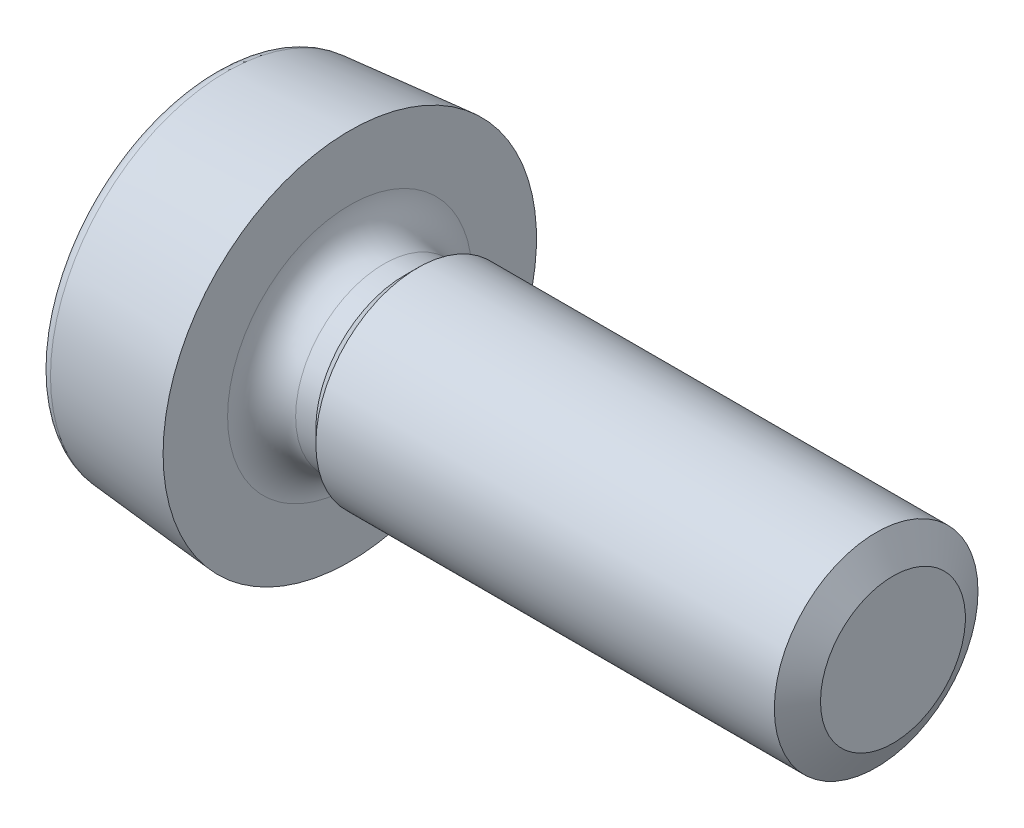
ISO-10303-21;
HEADER;
FILE_DESCRIPTION(('STEP AP214'),'2;1');
FILE_NAME('part.step','',(''),(''),'','','');
FILE_SCHEMA(('AUTOMOTIVE_DESIGN { 1 0 10303 214 1 1 1 1 }'));
ENDSEC;
DATA;
#1=APPLICATION_CONTEXT('core data for automotive mechanical design processes');
#2=APPLICATION_PROTOCOL_DEFINITION('international standard','automotive_design',2000,#1);
#3=PRODUCT_CONTEXT('',#1,'mechanical');
#4=PRODUCT('Part','Part','',(#3));
#5=PRODUCT_RELATED_PRODUCT_CATEGORY('part','',(#4));
#6=PRODUCT_DEFINITION_FORMATION('','',#4);
#7=PRODUCT_DEFINITION_CONTEXT('part definition',#1,'design');
#8=PRODUCT_DEFINITION('design','',#6,#7);
#9=PRODUCT_DEFINITION_SHAPE('','',#8);
#10=(LENGTH_UNIT() NAMED_UNIT(*) SI_UNIT(.MILLI.,.METRE.));
#11=(NAMED_UNIT(*) PLANE_ANGLE_UNIT() SI_UNIT($,.RADIAN.));
#12=(NAMED_UNIT(*) SI_UNIT($,.STERADIAN.) SOLID_ANGLE_UNIT());
#13=UNCERTAINTY_MEASURE_WITH_UNIT(LENGTH_MEASURE(1.E-05),#10,'distance_accuracy_value','');
#14=(GEOMETRIC_REPRESENTATION_CONTEXT(3) GLOBAL_UNCERTAINTY_ASSIGNED_CONTEXT((#13)) GLOBAL_UNIT_ASSIGNED_CONTEXT((#10,
#11,#12)) REPRESENTATION_CONTEXT('',''));
#15=CARTESIAN_POINT('',(0.,0.,0.));
#16=DIRECTION('',(0.,0.,1.));
#17=DIRECTION('',(1.,0.,0.));
#18=AXIS2_PLACEMENT_3D('',#15,#16,#17);
#19=CARTESIAN_POINT('',(0.,2.39175643814468,0.));
#20=DIRECTION('',(1.,0.,0.));
#21=DIRECTION('',(0.,0.,-1.));
#22=AXIS2_PLACEMENT_3D('',#19,#20,#21);
#23=PLANE('',#22);
#24=CARTESIAN_POINT('',(0.,0.,0.));
#25=DIRECTION('',(-1.,0.,0.));
#26=DIRECTION('',(0.,0.,1.));
#27=AXIS2_PLACEMENT_3D('',#24,#25,#26);
#28=CIRCLE('',#27,2.39175643814468);
#29=CARTESIAN_POINT('',(0.,0.,2.39175643814468));
#30=VERTEX_POINT('',#29);
#31=EDGE_CURVE('E171',#30,#30,#28,.T.);
#32=ORIENTED_EDGE('',*,*,#31,.T.);
#33=EDGE_LOOP('',(#32));
#34=FACE_BOUND('',#33,.T.);
#35=DIRECTION('',(0.,0.,1.));
#36=VECTOR('',#35,1.);
#37=CARTESIAN_POINT('',(0.,-0.250000000000006,1.75));
#38=LINE('',#37,#36);
#39=CARTESIAN_POINT('',(0.,-0.250000000000001,0.25));
#40=VERTEX_POINT('',#39);
#41=CARTESIAN_POINT('',(0.,-0.250000000000006,1.75));
#42=VERTEX_POINT('',#41);
#43=EDGE_CURVE('E137',#40,#42,#38,.T.);
#44=ORIENTED_EDGE('',*,*,#43,.F.);
#45=DIRECTION('',(0.,1.,0.));
#46=VECTOR('',#45,1.);
#47=CARTESIAN_POINT('',(0.,1.75,0.25));
#48=LINE('',#47,#46);
#49=CARTESIAN_POINT('',(0.,-1.75,0.25));
#50=VERTEX_POINT('',#49);
#51=EDGE_CURVE('E156',#50,#40,#48,.T.);
#52=ORIENTED_EDGE('',*,*,#51,.F.);
#53=DIRECTION('',(0.,0.,1.));
#54=VECTOR('',#53,1.);
#55=CARTESIAN_POINT('',(0.,-1.75,-0.25));
#56=LINE('',#55,#54);
#57=CARTESIAN_POINT('',(0.,-1.75,-0.25));
#58=VERTEX_POINT('',#57);
#59=EDGE_CURVE('E148',#58,#50,#56,.T.);
#60=ORIENTED_EDGE('',*,*,#59,.F.);
#61=DIRECTION('',(0.,-1.,0.));
#62=VECTOR('',#61,1.);
#63=CARTESIAN_POINT('',(0.,1.75,-0.25));
#64=LINE('',#63,#62);
#65=CARTESIAN_POINT('',(0.,-0.249999999999999,-0.25));
#66=VERTEX_POINT('',#65);
#67=EDGE_CURVE('E80',#66,#58,#64,.T.);
#68=ORIENTED_EDGE('',*,*,#67,.F.);
#69=CARTESIAN_POINT('',(0.,-0.249999999999994,-1.75));
#70=VERTEX_POINT('',#69);
#71=EDGE_CURVE('E95',#70,#66,#38,.T.);
#72=ORIENTED_EDGE('',*,*,#71,.F.);
#73=DIRECTION('',(0.,-1.,0.));
#74=VECTOR('',#73,1.);
#75=CARTESIAN_POINT('',(0.,0.250000000000006,-1.75));
#76=LINE('',#75,#74);
#77=CARTESIAN_POINT('',(0.,0.250000000000006,-1.75));
#78=VERTEX_POINT('',#77);
#79=EDGE_CURVE('E133',#78,#70,#76,.T.);
#80=ORIENTED_EDGE('',*,*,#79,.F.);
#81=DIRECTION('',(0.,0.,-1.));
#82=VECTOR('',#81,1.);
#83=CARTESIAN_POINT('',(0.,0.249999999999994,1.75));
#84=LINE('',#83,#82);
#85=CARTESIAN_POINT('',(0.,0.250000000000001,-0.25));
#86=VERTEX_POINT('',#85);
#87=EDGE_CURVE('E134',#86,#78,#84,.T.);
#88=ORIENTED_EDGE('',*,*,#87,.F.);
#89=CARTESIAN_POINT('',(0.,1.75,-0.25));
#90=VERTEX_POINT('',#89);
#91=EDGE_CURVE('E151',#90,#86,#64,.T.);
#92=ORIENTED_EDGE('',*,*,#91,.F.);
#93=DIRECTION('',(0.,0.,-1.));
#94=VECTOR('',#93,1.);
#95=CARTESIAN_POINT('',(0.,1.75,-0.25));
#96=LINE('',#95,#94);
#97=CARTESIAN_POINT('',(0.,1.75,0.25));
#98=VERTEX_POINT('',#97);
#99=EDGE_CURVE('E153',#98,#90,#96,.T.);
#100=ORIENTED_EDGE('',*,*,#99,.F.);
#101=CARTESIAN_POINT('',(0.,0.249999999999999,0.25));
#102=VERTEX_POINT('',#101);
#103=EDGE_CURVE('E65',#102,#98,#48,.T.);
#104=ORIENTED_EDGE('',*,*,#103,.F.);
#105=CARTESIAN_POINT('',(0.,0.249999999999994,1.75));
#106=VERTEX_POINT('',#105);
#107=EDGE_CURVE('E127',#106,#102,#84,.T.);
#108=ORIENTED_EDGE('',*,*,#107,.F.);
#109=DIRECTION('',(0.,1.,0.));
#110=VECTOR('',#109,1.);
#111=CARTESIAN_POINT('',(0.,0.249999999999994,1.75));
#112=LINE('',#111,#110);
#113=EDGE_CURVE('E115',#42,#106,#112,.T.);
#114=ORIENTED_EDGE('',*,*,#113,.F.);
#115=EDGE_LOOP('',(#44,#52,#60,#68,#72,#80,#88,#92,#100,#104,#108,#114));
#116=FACE_BOUND('',#115,.T.);
#117=ADVANCED_FACE('F42',(#34,#116),#23,.F.);
#118=CARTESIAN_POINT('',(0.86,0.,0.));
#119=DIRECTION('',(-0.279142362954213,0.,-0.960249728562492));
#120=DIRECTION('',(-0.960249728562492,0.,0.279142362954213));
#121=AXIS2_PLACEMENT_3D('',#118,#119,#120);
#122=PLANE('',#121);
#123=ORIENTED_EDGE('',*,*,#51,.T.);
#124=DIRECTION('',(0.924891601078248,0.268863837522747,-0.268863837522746));
#125=VECTOR('',#124,1.);
#126=CARTESIAN_POINT('',(0.86,0.,0.));
#127=LINE('',#126,#125);
#128=CARTESIAN_POINT('',(0.86,0.,0.));
#129=VERTEX_POINT('',#128);
#130=EDGE_CURVE('E87',#40,#129,#127,.T.);
#131=ORIENTED_EDGE('',*,*,#130,.T.);
#132=DIRECTION('',(0.437467884982116,0.890196277579888,-0.127170896797127));
#133=VECTOR('',#132,1.);
#134=CARTESIAN_POINT('',(0.,-1.75,0.25));
#135=LINE('',#134,#133);
#136=EDGE_CURVE('E161',#50,#129,#135,.T.);
#137=ORIENTED_EDGE('',*,*,#136,.F.);
#138=EDGE_LOOP('',(#123,#131,#137));
#139=FACE_BOUND('',#138,.T.);
#140=ADVANCED_FACE('F205',(#139),#122,.T.);
#141=DIRECTION('',(0.437467884982116,-0.890196277579888,-0.127170896797127));
#142=VECTOR('',#141,1.);
#143=CARTESIAN_POINT('',(0.,1.75,0.25));
#144=LINE('',#143,#142);
#145=EDGE_CURVE('E159',#98,#129,#144,.T.);
#146=ORIENTED_EDGE('',*,*,#145,.T.);
#147=DIRECTION('',(-0.924891601078248,0.268863837522746,0.268863837522747));
#148=VECTOR('',#147,1.);
#149=CARTESIAN_POINT('',(0.86,0.,0.));
#150=LINE('',#149,#148);
#151=EDGE_CURVE('E123',#129,#102,#150,.T.);
#152=ORIENTED_EDGE('',*,*,#151,.T.);
#153=ORIENTED_EDGE('',*,*,#103,.T.);
#154=EDGE_LOOP('',(#146,#152,#153));
#155=FACE_BOUND('',#154,.T.);
#156=ADVANCED_FACE('F198',(#155),#122,.T.);
#157=CARTESIAN_POINT('',(0.86,0.,0.));
#158=DIRECTION('',(-0.279142362954213,0.,0.960249728562492));
#159=DIRECTION('',(0.960249728562492,0.,0.279142362954213));
#160=AXIS2_PLACEMENT_3D('',#157,#158,#159);
#161=PLANE('',#160);
#162=DIRECTION('',(0.437467884982116,0.890196277579888,0.127170896797127));
#163=VECTOR('',#162,1.);
#164=CARTESIAN_POINT('',(0.,-1.75,-0.25));
#165=LINE('',#164,#163);
#166=EDGE_CURVE('E147',#58,#129,#165,.T.);
#167=ORIENTED_EDGE('',*,*,#166,.T.);
#168=DIRECTION('',(-0.924891601078248,-0.268863837522746,-0.268863837522747));
#169=VECTOR('',#168,1.);
#170=CARTESIAN_POINT('',(0.86,0.,0.));
#171=LINE('',#170,#169);
#172=EDGE_CURVE('E11',#129,#66,#171,.T.);
#173=ORIENTED_EDGE('',*,*,#172,.T.);
#174=ORIENTED_EDGE('',*,*,#67,.T.);
#175=EDGE_LOOP('',(#167,#173,#174));
#176=FACE_BOUND('',#175,.T.);
#177=ADVANCED_FACE('F199',(#176),#161,.T.);
#178=ORIENTED_EDGE('',*,*,#91,.T.);
#179=DIRECTION('',(0.924891601078248,-0.268863837522747,0.268863837522746));
#180=VECTOR('',#179,1.);
#181=CARTESIAN_POINT('',(0.86,0.,0.));
#182=LINE('',#181,#180);
#183=EDGE_CURVE('E49',#86,#129,#182,.T.);
#184=ORIENTED_EDGE('',*,*,#183,.T.);
#185=DIRECTION('',(0.437467884982116,-0.890196277579888,0.127170896797127));
#186=VECTOR('',#185,1.);
#187=CARTESIAN_POINT('',(0.,1.75,-0.25));
#188=LINE('',#187,#186);
#189=EDGE_CURVE('E56',#90,#129,#188,.T.);
#190=ORIENTED_EDGE('',*,*,#189,.F.);
#191=EDGE_LOOP('',(#178,#184,#190));
#192=FACE_BOUND('',#191,.T.);
#193=ADVANCED_FACE('F192',(#192),#161,.T.);
#194=CARTESIAN_POINT('',(-2.16958058991907,0.,0.));
#195=DIRECTION('',(-1.,0.,0.));
#196=DIRECTION('',(0.,0.,1.));
#197=AXIS2_PLACEMENT_3D('',#194,#195,#196);
#198=CYLINDRICAL_SURFACE('',#197,1.5);
#199=CARTESIAN_POINT('',(3.,0.,0.));
#200=DIRECTION('',(-1.,0.,0.));
#201=DIRECTION('',(0.,0.,1.));
#202=AXIS2_PLACEMENT_3D('',#199,#200,#201);
#203=CIRCLE('',#202,1.5);
#204=CARTESIAN_POINT('',(3.,0.,1.5));
#205=VERTEX_POINT('',#204);
#206=EDGE_CURVE('E190',#205,#205,#203,.T.);
#207=ORIENTED_EDGE('',*,*,#206,.F.);
#208=EDGE_LOOP('',(#207));
#209=FACE_BOUND('',#208,.T.);
#210=CARTESIAN_POINT('',(9.75270800287212,0.,0.));
#211=DIRECTION('',(-1.,0.,0.));
#212=DIRECTION('',(0.,0.,1.));
#213=AXIS2_PLACEMENT_3D('',#210,#211,#212);
#214=CIRCLE('',#213,1.5);
#215=CARTESIAN_POINT('',(9.75270800287212,0.,1.5));
#216=VERTEX_POINT('',#215);
#217=EDGE_CURVE('E168',#216,#216,#214,.T.);
#218=ORIENTED_EDGE('',*,*,#217,.T.);
#219=EDGE_LOOP('',(#218));
#220=FACE_BOUND('',#219,.T.);
#221=ADVANCED_FACE('F263',(#209,#220),#198,.T.);
#222=CARTESIAN_POINT('',(3.,0.,0.));
#223=DIRECTION('',(1.,0.,0.));
#224=DIRECTION('',(0.,0.,-1.));
#225=AXIS2_PLACEMENT_3D('',#222,#223,#224);
#226=CONICAL_SURFACE('',#225,1.5,0.785398163397445);
#227=CARTESIAN_POINT('',(2.799,0.,0.));
#228=DIRECTION('',(-1.,0.,0.));
#229=DIRECTION('',(0.,0.,1.));
#230=AXIS2_PLACEMENT_3D('',#227,#228,#229);
#231=CIRCLE('',#230,1.299);
#232=CARTESIAN_POINT('',(2.799,0.,1.299));
#233=VERTEX_POINT('',#232);
#234=EDGE_CURVE('E187',#233,#233,#231,.T.);
#235=ORIENTED_EDGE('',*,*,#234,.F.);
#236=EDGE_LOOP('',(#235));
#237=FACE_BOUND('',#236,.T.);
#238=ORIENTED_EDGE('',*,*,#206,.T.);
#239=EDGE_LOOP('',(#238));
#240=FACE_BOUND('',#239,.T.);
#241=ADVANCED_FACE('F257',(#237,#240),#226,.T.);
#242=CARTESIAN_POINT('',(-2.16958058991907,0.,0.));
#243=DIRECTION('',(-1.,0.,0.));
#244=DIRECTION('',(0.,0.,1.));
#245=AXIS2_PLACEMENT_3D('',#242,#243,#244);
#246=CYLINDRICAL_SURFACE('',#245,1.299);
#247=CARTESIAN_POINT('',(2.501,0.,0.));
#248=DIRECTION('',(-1.,0.,0.));
#249=DIRECTION('',(0.,0.,1.));
#250=AXIS2_PLACEMENT_3D('',#247,#248,#249);
#251=CIRCLE('',#250,1.299);
#252=CARTESIAN_POINT('',(2.501,0.,1.299));
#253=VERTEX_POINT('',#252);
#254=EDGE_CURVE('E184',#253,#253,#251,.T.);
#255=ORIENTED_EDGE('',*,*,#254,.F.);
#256=EDGE_LOOP('',(#255));
#257=FACE_BOUND('',#256,.T.);
#258=ORIENTED_EDGE('',*,*,#234,.T.);
#259=EDGE_LOOP('',(#258));
#260=FACE_BOUND('',#259,.T.);
#261=ADVANCED_FACE('F251',(#257,#260),#246,.T.);
#262=CARTESIAN_POINT('',(2.501,0.,0.));
#263=DIRECTION('',(-1.,0.,0.));
#264=DIRECTION('',(0.,0.,1.));
#265=AXIS2_PLACEMENT_3D('',#262,#263,#264);
#266=TOROIDAL_SURFACE('',#265,1.8,0.501);
#267=CARTESIAN_POINT('',(2.,0.,0.));
#268=DIRECTION('',(-1.,0.,0.));
#269=DIRECTION('',(0.,0.,1.));
#270=AXIS2_PLACEMENT_3D('',#267,#268,#269);
#271=CIRCLE('',#270,1.8);
#272=CARTESIAN_POINT('',(2.,0.,1.8));
#273=VERTEX_POINT('',#272);
#274=EDGE_CURVE('E181',#273,#273,#271,.T.);
#275=ORIENTED_EDGE('',*,*,#274,.F.);
#276=EDGE_LOOP('',(#275));
#277=FACE_BOUND('',#276,.T.);
#278=ORIENTED_EDGE('',*,*,#254,.T.);
#279=EDGE_LOOP('',(#278));
#280=FACE_BOUND('',#279,.T.);
#281=ADVANCED_FACE('F245',(#277,#280),#266,.F.);
#282=CARTESIAN_POINT('',(2.,1.8,0.));
#283=DIRECTION('',(-1.,0.,0.));
#284=DIRECTION('',(0.,0.,1.));
#285=AXIS2_PLACEMENT_3D('',#282,#283,#284);
#286=PLANE('',#285);
#287=CARTESIAN_POINT('',(2.,0.,0.));
#288=DIRECTION('',(-1.,0.,0.));
#289=DIRECTION('',(0.,0.,1.));
#290=AXIS2_PLACEMENT_3D('',#287,#288,#289);
#291=CIRCLE('',#290,2.75);
#292=CARTESIAN_POINT('',(2.,0.,2.75));
#293=VERTEX_POINT('',#292);
#294=EDGE_CURVE('E177',#293,#293,#291,.T.);
#295=ORIENTED_EDGE('',*,*,#294,.F.);
#296=EDGE_LOOP('',(#295));
#297=FACE_BOUND('',#296,.T.);
#298=ORIENTED_EDGE('',*,*,#274,.T.);
#299=EDGE_LOOP('',(#298));
#300=FACE_BOUND('',#299,.T.);
#301=ADVANCED_FACE('F239',(#297,#300),#286,.F.);
#302=CARTESIAN_POINT('',(2.,0.,0.));
#303=DIRECTION('',(1.,0.,0.));
#304=DIRECTION('',(0.,0.,-1.));
#305=AXIS2_PLACEMENT_3D('',#302,#303,#304);
#306=CONICAL_SURFACE('',#305,2.75,0.08726646259971);
#307=CARTESIAN_POINT('',(0.18256885145047,0.,0.));
#308=DIRECTION('',(-1.,0.,0.));
#309=DIRECTION('',(0.,0.,1.));
#310=AXIS2_PLACEMENT_3D('',#307,#308,#309);
#311=CIRCLE('',#310,2.59099537776303);
#312=CARTESIAN_POINT('',(0.18256885145047,0.,2.59099537776303));
#313=VERTEX_POINT('',#312);
#314=EDGE_CURVE('E174',#313,#313,#311,.T.);
#315=ORIENTED_EDGE('',*,*,#314,.F.);
#316=EDGE_LOOP('',(#315));
#317=FACE_BOUND('',#316,.T.);
#318=ORIENTED_EDGE('',*,*,#294,.T.);
#319=EDGE_LOOP('',(#318));
#320=FACE_BOUND('',#319,.T.);
#321=ADVANCED_FACE('F233',(#317,#320),#306,.T.);
#322=CARTESIAN_POINT('',(0.2,0.,0.));
#323=DIRECTION('',(-1.,0.,0.));
#324=DIRECTION('',(0.,0.,1.));
#325=AXIS2_PLACEMENT_3D('',#322,#323,#324);
#326=TOROIDAL_SURFACE('',#325,2.39175643814468,0.2);
#327=ORIENTED_EDGE('',*,*,#31,.F.);
#328=EDGE_LOOP('',(#327));
#329=FACE_BOUND('',#328,.T.);
#330=ORIENTED_EDGE('',*,*,#314,.T.);
#331=EDGE_LOOP('',(#330));
#332=FACE_BOUND('',#331,.T.);
#333=ADVANCED_FACE('F229',(#329,#332),#326,.T.);
#334=CARTESIAN_POINT('',(9.75270800287212,0.,0.));
#335=DIRECTION('',(-1.,0.,0.));
#336=DIRECTION('',(0.,0.,1.));
#337=AXIS2_PLACEMENT_3D('',#334,#335,#336);
#338=CONICAL_SURFACE('',#337,1.5,1.05188801855287);
#339=CARTESIAN_POINT('',(10.,0.,0.));
#340=DIRECTION('',(-1.,0.,0.));
#341=DIRECTION('',(0.,0.,1.));
#342=AXIS2_PLACEMENT_3D('',#339,#340,#341);
#343=CIRCLE('',#342,1.067);
#344=CARTESIAN_POINT('',(10.,0.,1.067));
#345=VERTEX_POINT('',#344);
#346=EDGE_CURVE('E155',#345,#345,#343,.T.);
#347=ORIENTED_EDGE('',*,*,#346,.T.);
#348=EDGE_LOOP('',(#347));
#349=FACE_BOUND('',#348,.T.);
#350=ORIENTED_EDGE('',*,*,#217,.F.);
#351=EDGE_LOOP('',(#350));
#352=FACE_BOUND('',#351,.T.);
#353=ADVANCED_FACE('F232',(#349,#352),#338,.T.);
#354=CARTESIAN_POINT('',(10.,0.,0.));
#355=DIRECTION('',(-1.,0.,0.));
#356=DIRECTION('',(0.,0.,1.));
#357=AXIS2_PLACEMENT_3D('',#354,#355,#356);
#358=PLANE('',#357);
#359=ORIENTED_EDGE('',*,*,#346,.F.);
#360=EDGE_LOOP('',(#359));
#361=FACE_BOUND('',#360,.T.);
#362=ADVANCED_FACE('F273',(#361),#358,.F.);
#363=CARTESIAN_POINT('',(0.,1.75,0.25));
#364=DIRECTION('',(0.897483103574347,0.441048839470822,0.));
#365=DIRECTION('',(-0.441048839470822,0.897483103574347,0.));
#366=AXIS2_PLACEMENT_3D('',#363,#364,#365);
#367=PLANE('',#366);
#368=ORIENTED_EDGE('',*,*,#145,.F.);
#369=ORIENTED_EDGE('',*,*,#99,.T.);
#370=ORIENTED_EDGE('',*,*,#189,.T.);
#371=EDGE_LOOP('',(#368,#369,#370));
#372=FACE_BOUND('',#371,.T.);
#373=ADVANCED_FACE('F197',(#372),#367,.F.);
#374=CARTESIAN_POINT('',(0.,-1.75,-0.25));
#375=DIRECTION('',(0.897483103574347,-0.441048839470822,0.));
#376=DIRECTION('',(0.441048839470822,0.897483103574347,0.));
#377=AXIS2_PLACEMENT_3D('',#374,#375,#376);
#378=PLANE('',#377);
#379=ORIENTED_EDGE('',*,*,#166,.F.);
#380=ORIENTED_EDGE('',*,*,#59,.T.);
#381=ORIENTED_EDGE('',*,*,#136,.T.);
#382=EDGE_LOOP('',(#379,#380,#381));
#383=FACE_BOUND('',#382,.T.);
#384=ADVANCED_FACE('F202',(#383),#378,.F.);
#385=CARTESIAN_POINT('',(0.86,0.,0.));
#386=DIRECTION('',(-0.279142362954213,0.960249728562492,0.));
#387=DIRECTION('',(-0.960249728562492,-0.279142362954213,0.));
#388=AXIS2_PLACEMENT_3D('',#385,#386,#387);
#389=PLANE('',#388);
#390=DIRECTION('',(0.437467884982116,0.127170896797124,0.890196277579888));
#391=VECTOR('',#390,1.);
#392=CARTESIAN_POINT('',(0.,-0.249999999999994,-1.75));
#393=LINE('',#392,#391);
#394=EDGE_CURVE('E129',#70,#129,#393,.T.);
#395=ORIENTED_EDGE('',*,*,#394,.F.);
#396=ORIENTED_EDGE('',*,*,#71,.T.);
#397=ORIENTED_EDGE('',*,*,#172,.F.);
#398=EDGE_LOOP('',(#395,#396,#397));
#399=FACE_BOUND('',#398,.T.);
#400=ADVANCED_FACE('F210',(#399),#389,.T.);
#401=CARTESIAN_POINT('',(0.86,0.,0.));
#402=DIRECTION('',(-0.279142362954213,-0.960249728562492,0.));
#403=DIRECTION('',(0.960249728562492,-0.279142362954213,0.));
#404=AXIS2_PLACEMENT_3D('',#401,#402,#403);
#405=PLANE('',#404);
#406=ORIENTED_EDGE('',*,*,#87,.T.);
#407=DIRECTION('',(0.437467884982116,-0.12717089679713,0.890196277579887));
#408=VECTOR('',#407,1.);
#409=CARTESIAN_POINT('',(0.,0.250000000000006,-1.75));
#410=LINE('',#409,#408);
#411=EDGE_CURVE('E130',#78,#129,#410,.T.);
#412=ORIENTED_EDGE('',*,*,#411,.T.);
#413=ORIENTED_EDGE('',*,*,#183,.F.);
#414=EDGE_LOOP('',(#406,#412,#413));
#415=FACE_BOUND('',#414,.T.);
#416=ADVANCED_FACE('F216',(#415),#405,.T.);
#417=CARTESIAN_POINT('',(0.,0.250000000000006,-1.75));
#418=DIRECTION('',(0.897483103574347,0.,-0.441048839470822));
#419=DIRECTION('',(0.441048839470822,0.,0.897483103574347));
#420=AXIS2_PLACEMENT_3D('',#417,#418,#419);
#421=PLANE('',#420);
#422=ORIENTED_EDGE('',*,*,#411,.F.);
#423=ORIENTED_EDGE('',*,*,#79,.T.);
#424=ORIENTED_EDGE('',*,*,#394,.T.);
#425=EDGE_LOOP('',(#422,#423,#424));
#426=FACE_BOUND('',#425,.T.);
#427=ADVANCED_FACE('F208',(#426),#421,.F.);
#428=ORIENTED_EDGE('',*,*,#43,.T.);
#429=DIRECTION('',(0.437467884982116,0.12717089679713,-0.890196277579887));
#430=VECTOR('',#429,1.);
#431=CARTESIAN_POINT('',(0.,-0.250000000000006,1.75));
#432=LINE('',#431,#430);
#433=EDGE_CURVE('E120',#42,#129,#432,.T.);
#434=ORIENTED_EDGE('',*,*,#433,.T.);
#435=ORIENTED_EDGE('',*,*,#130,.F.);
#436=EDGE_LOOP('',(#428,#434,#435));
#437=FACE_BOUND('',#436,.T.);
#438=ADVANCED_FACE('F206',(#437),#389,.T.);
#439=DIRECTION('',(0.437467884982116,-0.127170896797124,-0.890196277579888));
#440=VECTOR('',#439,1.);
#441=CARTESIAN_POINT('',(0.,0.249999999999994,1.75));
#442=LINE('',#441,#440);
#443=EDGE_CURVE('E118',#106,#129,#442,.T.);
#444=ORIENTED_EDGE('',*,*,#443,.F.);
#445=ORIENTED_EDGE('',*,*,#107,.T.);
#446=ORIENTED_EDGE('',*,*,#151,.F.);
#447=EDGE_LOOP('',(#444,#445,#446));
#448=FACE_BOUND('',#447,.T.);
#449=ADVANCED_FACE('F126',(#448),#405,.T.);
#450=CARTESIAN_POINT('',(0.,-0.250000000000006,1.75));
#451=DIRECTION('',(0.897483103574347,0.,0.441048839470822));
#452=DIRECTION('',(-0.441048839470822,0.,0.897483103574347));
#453=AXIS2_PLACEMENT_3D('',#450,#451,#452);
#454=PLANE('',#453);
#455=ORIENTED_EDGE('',*,*,#433,.F.);
#456=ORIENTED_EDGE('',*,*,#113,.T.);
#457=ORIENTED_EDGE('',*,*,#443,.T.);
#458=EDGE_LOOP('',(#455,#456,#457));
#459=FACE_BOUND('',#458,.T.);
#460=ADVANCED_FACE('F117',(#459),#454,.F.);
#461=CLOSED_SHELL('',(#117,#140,#156,#177,#193,#221,#241,#261,#281,#301,#321,#333,#353,#362,
#373,#384,#400,#416,#427,#438,#449,#460));
#462=MANIFOLD_SOLID_BREP('B2',#461);
#463=ADVANCED_BREP_SHAPE_REPRESENTATION('',(#18,#462),#14);
#464=SHAPE_DEFINITION_REPRESENTATION(#9,#463);
ENDSEC;
END-ISO-10303-21;
